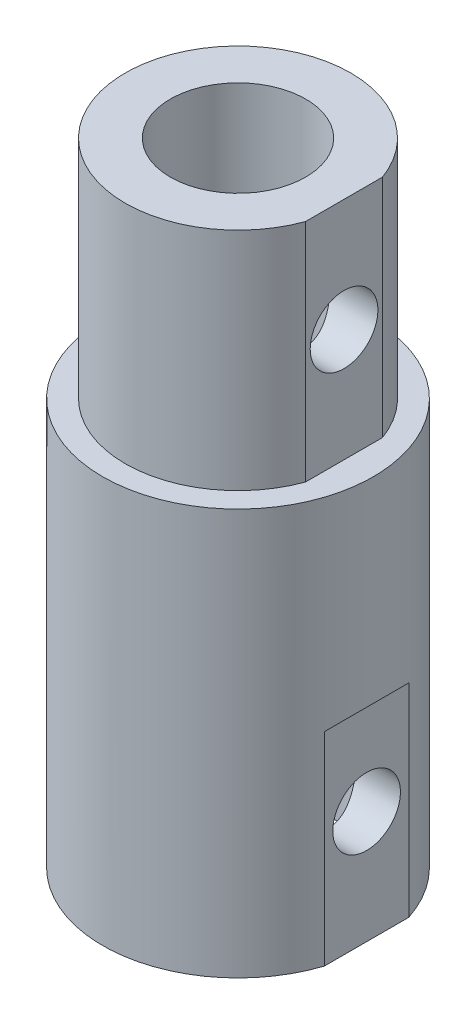
ISO-10303-21;
HEADER;
FILE_DESCRIPTION(('STEP AP214'),'2;1');
FILE_NAME('part.step','',(''),(''),'','','');
FILE_SCHEMA(('AUTOMOTIVE_DESIGN { 1 0 10303 214 1 1 1 1 }'));
ENDSEC;
DATA;
#1=APPLICATION_CONTEXT('core data for automotive mechanical design processes');
#2=APPLICATION_PROTOCOL_DEFINITION('international standard','automotive_design',2000,#1);
#3=PRODUCT_CONTEXT('',#1,'mechanical');
#4=PRODUCT('Part','Part','',(#3));
#5=PRODUCT_RELATED_PRODUCT_CATEGORY('part','',(#4));
#6=PRODUCT_DEFINITION_FORMATION('','',#4);
#7=PRODUCT_DEFINITION_CONTEXT('part definition',#1,'design');
#8=PRODUCT_DEFINITION('design','',#6,#7);
#9=PRODUCT_DEFINITION_SHAPE('','',#8);
#10=(LENGTH_UNIT() NAMED_UNIT(*) SI_UNIT(.MILLI.,.METRE.));
#11=(NAMED_UNIT(*) PLANE_ANGLE_UNIT() SI_UNIT($,.RADIAN.));
#12=(NAMED_UNIT(*) SI_UNIT($,.STERADIAN.) SOLID_ANGLE_UNIT());
#13=UNCERTAINTY_MEASURE_WITH_UNIT(LENGTH_MEASURE(1.E-05),#10,'distance_accuracy_value','');
#14=(GEOMETRIC_REPRESENTATION_CONTEXT(3) GLOBAL_UNCERTAINTY_ASSIGNED_CONTEXT((#13)) GLOBAL_UNIT_ASSIGNED_CONTEXT((#10,
#11,#12)) REPRESENTATION_CONTEXT('',''));
#15=CARTESIAN_POINT('',(0.,0.,0.));
#16=DIRECTION('',(0.,0.,1.));
#17=DIRECTION('',(1.,0.,0.));
#18=AXIS2_PLACEMENT_3D('',#15,#16,#17);
#19=CARTESIAN_POINT('',(0.,28.,0.));
#20=DIRECTION('',(0.,-1.,0.));
#21=DIRECTION('',(0.,0.,-1.));
#22=AXIS2_PLACEMENT_3D('',#19,#20,#21);
#23=CYLINDRICAL_SURFACE('',#22,5.);
#24=CARTESIAN_POINT('',(0.,28.,0.));
#25=DIRECTION('',(0.,1.,0.));
#26=DIRECTION('',(0.,0.,1.));
#27=AXIS2_PLACEMENT_3D('',#24,#25,#26);
#28=CIRCLE('',#27,5.);
#29=CARTESIAN_POINT('',(4.7,28.,-1.7058722109232));
#30=VERTEX_POINT('',#29);
#31=CARTESIAN_POINT('',(4.7,28.,1.7058722109232));
#32=VERTEX_POINT('',#31);
#33=EDGE_CURVE('E82',#30,#32,#28,.T.);
#34=ORIENTED_EDGE('',*,*,#33,.F.);
#35=DIRECTION('',(0.,-1.,0.));
#36=VECTOR('',#35,1.);
#37=CARTESIAN_POINT('',(4.7,28.,-1.7058722109232));
#38=LINE('',#37,#36);
#39=CARTESIAN_POINT('',(4.7,18.,-1.7058722109232));
#40=VERTEX_POINT('',#39);
#41=EDGE_CURVE('E49',#30,#40,#38,.T.);
#42=ORIENTED_EDGE('',*,*,#41,.T.);
#43=CARTESIAN_POINT('',(0.,18.,0.));
#44=DIRECTION('',(0.,1.,0.));
#45=DIRECTION('',(0.,0.,1.));
#46=AXIS2_PLACEMENT_3D('',#43,#44,#45);
#47=CIRCLE('',#46,5.);
#48=CARTESIAN_POINT('',(4.7,18.,1.7058722109232));
#49=VERTEX_POINT('',#48);
#50=EDGE_CURVE('E84',#40,#49,#47,.T.);
#51=ORIENTED_EDGE('',*,*,#50,.T.);
#52=DIRECTION('',(0.,-1.,0.));
#53=VECTOR('',#52,1.);
#54=CARTESIAN_POINT('',(4.7,28.,1.7058722109232));
#55=LINE('',#54,#53);
#56=EDGE_CURVE('E73',#49,#32,#55,.F.);
#57=ORIENTED_EDGE('',*,*,#56,.T.);
#58=EDGE_LOOP('',(#34,#42,#51,#57));
#59=FACE_BOUND('',#58,.T.);
#60=ADVANCED_FACE('F33',(#59),#23,.T.);
#61=CARTESIAN_POINT('',(0.,28.,0.));
#62=DIRECTION('',(0.,-1.,0.));
#63=DIRECTION('',(0.,0.,-1.));
#64=AXIS2_PLACEMENT_3D('',#61,#62,#63);
#65=CYLINDRICAL_SURFACE('',#64,3.);
#66=CARTESIAN_POINT('',(0.,18.,0.));
#67=DIRECTION('',(0.,1.,0.));
#68=DIRECTION('',(0.,0.,1.));
#69=AXIS2_PLACEMENT_3D('',#66,#67,#68);
#70=CIRCLE('',#69,3.);
#71=CARTESIAN_POINT('',(0.,18.,3.));
#72=VERTEX_POINT('',#71);
#73=EDGE_CURVE('E106',#72,#72,#70,.F.);
#74=ORIENTED_EDGE('',*,*,#73,.T.);
#75=EDGE_LOOP('',(#74));
#76=FACE_BOUND('',#75,.T.);
#77=CARTESIAN_POINT('',(0.,28.,0.));
#78=DIRECTION('',(0.,1.,0.));
#79=DIRECTION('',(0.,0.,1.));
#80=AXIS2_PLACEMENT_3D('',#77,#78,#79);
#81=CIRCLE('',#80,3.);
#82=CARTESIAN_POINT('',(0.,28.,3.));
#83=VERTEX_POINT('',#82);
#84=EDGE_CURVE('E93',#83,#83,#81,.T.);
#85=ORIENTED_EDGE('',*,*,#84,.T.);
#86=EDGE_LOOP('',(#85));
#87=FACE_BOUND('',#86,.T.);
#88=CARTESIAN_POINT('',(2.59807621135332,23.,1.5));
#89=CARTESIAN_POINT('',(2.59808302092689,22.9218382877071,1.4999945446118));
#90=CARTESIAN_POINT('',(2.60165701781635,22.8435778827124,1.49384995609983));
#91=CARTESIAN_POINT('',(2.61543549678079,22.6894591029843,1.46958481484708));
#92=CARTESIAN_POINT('',(2.62565391083339,22.6136061274349,1.45143909683127));
#93=CARTESIAN_POINT('',(2.65124019908098,22.4668225034841,1.40414992304972));
#94=CARTESIAN_POINT('',(2.66658065209878,22.3958680212896,1.3750649287406));
#95=CARTESIAN_POINT('',(2.70063997225287,22.2598636970049,1.30690128806456));
#96=CARTESIAN_POINT('',(2.71935902214097,22.1948141746063,1.26782210105366));
#97=CARTESIAN_POINT('',(2.75995303586162,22.0665414071637,1.17699981079632));
#98=CARTESIAN_POINT('',(2.7819609545693,22.0039112964897,1.12447805421566));
#99=CARTESIAN_POINT('',(2.82557974178559,21.8878874173899,1.0098807114217));
#100=CARTESIAN_POINT('',(2.84719040746875,21.8344982561247,0.94780038867344));
#101=CARTESIAN_POINT('',(2.88932215429424,21.7349492732785,0.810734345121819));
#102=CARTESIAN_POINT('',(2.90967159627259,21.6895193482107,0.735160783518863));
#103=CARTESIAN_POINT('',(2.94526134149294,21.6122887201314,0.576235539899257));
#104=CARTESIAN_POINT('',(2.96050486775612,21.5804794157942,0.492888807207233));
#105=CARTESIAN_POINT('',(2.98320691866356,21.5337430080484,0.327067415888965));
#106=CARTESIAN_POINT('',(2.99114220331338,21.5177757104667,0.244952685733226));
#107=CARTESIAN_POINT('',(3.00011375769101,21.4997508219874,0.0788559430467718));
#108=CARTESIAN_POINT('',(3.00115420176885,21.4976848148064,-0.00512490876560811));
#109=CARTESIAN_POINT('',(2.99644472874675,21.5071200109555,-0.164748786635626));
#110=CARTESIAN_POINT('',(2.99127743838241,21.5174570232818,-0.240481798765188));
#111=CARTESIAN_POINT('',(2.97561367889621,21.549321265857,-0.388970657877483));
#112=CARTESIAN_POINT('',(2.96511681099591,21.5708493334643,-0.461726281640888));
#113=CARTESIAN_POINT('',(2.93957374931482,21.6246238491347,-0.603464087354331));
#114=CARTESIAN_POINT('',(2.92446662293799,21.6570144697581,-0.672380135272769));
#115=CARTESIAN_POINT('',(2.89106468980031,21.7313951243022,-0.803965202269994));
#116=CARTESIAN_POINT('',(2.87276874236226,21.7733885949535,-0.866631973257969));
#117=CARTESIAN_POINT('',(2.83266591598844,21.8703430272995,-0.990260491347293));
#118=CARTESIAN_POINT('',(2.81069063997263,21.926154542489,-1.05050111254404));
#119=CARTESIAN_POINT('',(2.76681510880218,22.0468845873953,-1.16115655544667));
#120=CARTESIAN_POINT('',(2.74491492398443,22.1118100584111,-1.21156381736135));
#121=CARTESIAN_POINT('',(2.70216234138727,22.2539722886361,-1.30425800196332));
#122=CARTESIAN_POINT('',(2.68146479986061,22.3317290345813,-1.34582597246708));
#123=CARTESIAN_POINT('',(2.64563175417864,22.4944065070385,-1.41497866950185));
#124=CARTESIAN_POINT('',(2.63049045069101,22.5793196495263,-1.44257798731634));
#125=CARTESIAN_POINT('',(2.60916953725552,22.7468217669242,-1.48077031653756));
#126=CARTESIAN_POINT('',(2.60237483772745,22.8290616785653,-1.49253768317996));
#127=CARTESIAN_POINT('',(2.59676879042414,22.9946020122748,-1.50227541991714));
#128=CARTESIAN_POINT('',(2.59795180333967,23.0779016436797,-1.50025553597254));
#129=CARTESIAN_POINT('',(2.60751504810877,23.2334808778681,-1.48355406501595));
#130=CARTESIAN_POINT('',(2.61509381259981,23.3059691766619,-1.4702817250687));
#131=CARTESIAN_POINT('',(2.63541032327012,23.4475516794064,-1.43354442694866));
#132=CARTESIAN_POINT('',(2.64814974007551,23.5166447761199,-1.41007616793542));
#133=CARTESIAN_POINT('',(2.67804333119485,23.653116996354,-1.35247138290733));
#134=CARTESIAN_POINT('',(2.69537464864595,23.7202685252803,-1.31789109553909));
#135=CARTESIAN_POINT('',(2.73234179245875,23.8482039073085,-1.23943059602371));
#136=CARTESIAN_POINT('',(2.75197880032721,23.9089844652699,-1.19554560649833));
#137=CARTESIAN_POINT('',(2.79431997684504,24.0304681512853,-1.09325575079828));
#138=CARTESIAN_POINT('',(2.81709874731434,24.0901957260765,-1.03371790847245));
#139=CARTESIAN_POINT('',(2.86101352466839,24.1991183569904,-0.905106743097434));
#140=CARTESIAN_POINT('',(2.88214897511564,24.2483098553458,-0.836030211983022));
#141=CARTESIAN_POINT('',(2.92112042536435,24.3358605889252,-0.687803043838138));
#142=CARTESIAN_POINT('',(2.93885462508044,24.3738996773164,-0.608434646361172));
#143=CARTESIAN_POINT('',(2.96825032438951,24.4357068557861,-0.443283546961625));
#144=CARTESIAN_POINT('',(2.9799171551456,24.4594874770495,-0.357506552088266));
#145=CARTESIAN_POINT('',(2.99501262272824,24.490052846262,-0.190469523495627));
#146=CARTESIAN_POINT('',(2.99909891862287,24.4981968138142,-0.109517165775687));
#147=CARTESIAN_POINT('',(3.00063195562697,24.5012648981816,0.0526889789268048));
#148=CARTESIAN_POINT('',(2.99808102100335,24.4961936427854,0.13394265044263));
#149=CARTESIAN_POINT('',(2.98700953256884,24.4738753898066,0.28880698847572));
#150=CARTESIAN_POINT('',(2.97889342001985,24.4574527261135,0.362568476716895));
#151=CARTESIAN_POINT('',(2.95788140495135,24.4140095010455,0.506168928275425));
#152=CARTESIAN_POINT('',(2.94498481699194,24.3869874198598,0.576007327433262));
#153=CARTESIAN_POINT('',(2.9148889612218,24.321909421751,0.713135109367327));
#154=CARTESIAN_POINT('',(2.89752925798199,24.2834310151882,0.780187714050069));
#155=CARTESIAN_POINT('',(2.86032199712739,24.1970631037114,0.907161962721037));
#156=CARTESIAN_POINT('',(2.84047329837541,24.1491692763265,0.967080311122361));
#157=CARTESIAN_POINT('',(2.79792915339941,24.0398042914659,1.08437100623534));
#158=CARTESIAN_POINT('',(2.77514698517547,23.9774562687842,1.14089652680891));
#159=CARTESIAN_POINT('',(2.73094614244278,23.8438239183053,1.24299493109201));
#160=CARTESIAN_POINT('',(2.70952868642798,23.7725317686985,1.28855812501509));
#161=CARTESIAN_POINT('',(2.66999407957374,23.6200450301286,1.36864661967848));
#162=CARTESIAN_POINT('',(2.65200261384405,23.5386087033069,1.40277759894141));
#163=CARTESIAN_POINT('',(2.62299234492527,23.3700013934903,1.45631806425962));
#164=CARTESIAN_POINT('',(2.61195024221553,23.282850666631,1.47577678676302));
#165=CARTESIAN_POINT('',(2.60293908902686,23.162291966522,1.49155051179662));
#166=CARTESIAN_POINT('',(2.60112193507728,23.1299481584032,1.49471415744578));
#167=CARTESIAN_POINT('',(2.59868903831625,23.0650752789766,1.49894010763495));
#168=CARTESIAN_POINT('',(2.59807337587664,23.0325461954212,1.50000227159981));
#169=CARTESIAN_POINT('',(2.59807621135332,23.,1.5));
#170=B_SPLINE_CURVE_WITH_KNOTS('',3,(#88,#89,#90,#91,#92,#93,#94,#95,#96,#97,#98,#99,#100,#101,
#102,#103,#104,#105,#106,#107,#108,#109,#110,#111,#112,#113,#114,#115,#116,#117,#118,#119,#120,
#121,#122,#123,#124,#125,#126,#127,#128,#129,#130,#131,#132,#133,#134,#135,#136,#137,#138,#139,
#140,#141,#142,#143,#144,#145,#146,#147,#148,#149,#150,#151,#152,#153,#154,#155,#156,#157,#158,
#159,#160,#161,#162,#163,#164,#165,#166,#167,#168,#169),.UNSPECIFIED.,.T.,.F.,(4,2,2,2,2,2,2,2,
2,2,2,2,2,2,2,2,2,2,2,2,2,2,2,2,2,2,2,2,2,2,2,2,2,2,2,2,2,2,2,2,4),(0.,0.234348183892075,
0.469189339237207,0.702792893878331,0.936409088167727,1.18929346874735,1.44230356626557,
1.71236838358145,1.98226240445837,2.23295227451903,2.4834903552906,2.71224146226808,
2.94100968776183,3.1729430209672,3.40495949025408,3.65890787185336,3.91305072368878,
4.18333262594173,4.45333161317557,4.70193436281318,4.9503613978256,5.17161275136038,
5.39293578654095,5.62450944609132,5.85620229330071,6.1171011537092,6.37808797467303,
6.64596272119449,6.91360169713158,7.15668405584231,7.39968130190958,7.62666637307239,
7.8536840026802,8.09041126079208,8.32724745151079,8.58765362775102,8.84828914267732,
9.11716123557909,9.38512699504141,9.48270202777965,9.58028358741812),.UNSPECIFIED.);
#171=CARTESIAN_POINT('',(2.59807621135332,23.,1.5));
#172=VERTEX_POINT('',#171);
#173=EDGE_CURVE('E116',#172,#172,#170,.T.);
#174=ORIENTED_EDGE('',*,*,#173,.T.);
#175=EDGE_LOOP('',(#174));
#176=FACE_BOUND('',#175,.T.);
#177=ADVANCED_FACE('F134',(#76,#87,#176),#65,.F.);
#178=CARTESIAN_POINT('',(0.,10.,0.));
#179=DIRECTION('',(0.,-1.,0.));
#180=DIRECTION('',(0.,0.,-1.));
#181=AXIS2_PLACEMENT_3D('',#178,#179,#180);
#182=CYLINDRICAL_SURFACE('',#181,6.);
#183=DIRECTION('',(0.,-1.,0.));
#184=VECTOR('',#183,1.);
#185=CARTESIAN_POINT('',(5.7,10.,1.87349939951952));
#186=LINE('',#185,#184);
#187=CARTESIAN_POINT('',(5.7,0.,1.87349939951952));
#188=VERTEX_POINT('',#187);
#189=CARTESIAN_POINT('',(5.7,8.99999999999999,1.87349939951952));
#190=VERTEX_POINT('',#189);
#191=EDGE_CURVE('E170',#188,#190,#186,.F.);
#192=ORIENTED_EDGE('',*,*,#191,.T.);
#193=CARTESIAN_POINT('',(0.,3.30000000000005,0.));
#194=DIRECTION('',(-0.707106781186544,0.707106781186551,0.));
#195=DIRECTION('',(-0.707106781186551,-0.707106781186544,0.));
#196=AXIS2_PLACEMENT_3D('',#193,#194,#195);
#197=ELLIPSE('',#196,8.48528137423853,6.);
#198=CARTESIAN_POINT('',(5.7,8.99999999999999,-1.87349939951952));
#199=VERTEX_POINT('',#198);
#200=EDGE_CURVE('E11',#190,#199,#197,.T.);
#201=ORIENTED_EDGE('',*,*,#200,.T.);
#202=DIRECTION('',(0.,-1.,0.));
#203=VECTOR('',#202,1.);
#204=CARTESIAN_POINT('',(5.7,10.,-1.87349939951952));
#205=LINE('',#204,#203);
#206=CARTESIAN_POINT('',(5.7,0.,-1.87349939951952));
#207=VERTEX_POINT('',#206);
#208=EDGE_CURVE('E181',#199,#207,#205,.T.);
#209=ORIENTED_EDGE('',*,*,#208,.T.);
#210=CARTESIAN_POINT('',(0.,0.,0.));
#211=DIRECTION('',(0.,1.,0.));
#212=DIRECTION('',(0.,0.,1.));
#213=AXIS2_PLACEMENT_3D('',#210,#211,#212);
#214=CIRCLE('',#213,6.);
#215=EDGE_CURVE('E103',#207,#188,#214,.T.);
#216=ORIENTED_EDGE('',*,*,#215,.T.);
#217=EDGE_LOOP('',(#192,#201,#209,#216));
#218=FACE_BOUND('',#217,.T.);
#219=CARTESIAN_POINT('',(0.,18.,0.));
#220=DIRECTION('',(0.,1.,0.));
#221=DIRECTION('',(0.,0.,1.));
#222=AXIS2_PLACEMENT_3D('',#219,#220,#221);
#223=CIRCLE('',#222,6.);
#224=CARTESIAN_POINT('',(0.,18.,6.));
#225=VERTEX_POINT('',#224);
#226=EDGE_CURVE('E88',#225,#225,#223,.T.);
#227=ORIENTED_EDGE('',*,*,#226,.F.);
#228=EDGE_LOOP('',(#227));
#229=FACE_BOUND('',#228,.T.);
#230=ADVANCED_FACE('F138',(#218,#229),#182,.T.);
#231=CARTESIAN_POINT('',(0.,10.,0.));
#232=DIRECTION('',(0.,-1.,0.));
#233=DIRECTION('',(0.,0.,-1.));
#234=AXIS2_PLACEMENT_3D('',#231,#232,#233);
#235=CYLINDRICAL_SURFACE('',#234,4.);
#236=CARTESIAN_POINT('',(0.,0.,0.));
#237=DIRECTION('',(0.,1.,0.));
#238=DIRECTION('',(0.,0.,1.));
#239=AXIS2_PLACEMENT_3D('',#236,#237,#238);
#240=CIRCLE('',#239,4.);
#241=CARTESIAN_POINT('',(0.,0.,4.));
#242=VERTEX_POINT('',#241);
#243=EDGE_CURVE('E100',#242,#242,#240,.T.);
#244=ORIENTED_EDGE('',*,*,#243,.F.);
#245=EDGE_LOOP('',(#244));
#246=FACE_BOUND('',#245,.T.);
#247=CARTESIAN_POINT('',(0.,10.,0.));
#248=DIRECTION('',(0.,1.,0.));
#249=DIRECTION('',(0.,0.,1.));
#250=AXIS2_PLACEMENT_3D('',#247,#248,#249);
#251=CIRCLE('',#250,4.);
#252=CARTESIAN_POINT('',(0.,10.,4.));
#253=VERTEX_POINT('',#252);
#254=EDGE_CURVE('E91',#253,#253,#251,.T.);
#255=ORIENTED_EDGE('',*,*,#254,.T.);
#256=EDGE_LOOP('',(#255));
#257=FACE_BOUND('',#256,.T.);
#258=CARTESIAN_POINT('',(3.70809924354783,5.,1.5));
#259=CARTESIAN_POINT('',(3.70809640633806,4.91899251627921,1.50000304106109));
#260=CARTESIAN_POINT('',(3.71078260240986,4.83800507749636,1.49341597549487));
#261=CARTESIAN_POINT('',(3.72116159304967,4.6784719170868,1.46736187895468));
#262=CARTESIAN_POINT('',(3.72885423767112,4.59992612240499,1.44789523373263));
#263=CARTESIAN_POINT('',(3.748254802809,4.44762462838647,1.39689657610574));
#264=CARTESIAN_POINT('',(3.7599530956926,4.37385794334892,1.36539347266348));
#265=CARTESIAN_POINT('',(3.78603134206598,4.23262810318116,1.29131856742698));
#266=CARTESIAN_POINT('',(3.80041210067323,4.16516684971748,1.24874344095039));
#267=CARTESIAN_POINT('',(3.83103574665713,4.03510968837718,1.15146661374162));
#268=CARTESIAN_POINT('',(3.84733341923603,3.97287147037061,1.09630381213306));
#269=CARTESIAN_POINT('',(3.87949750628547,3.85827718532851,0.976395839778925));
#270=CARTESIAN_POINT('',(3.89536382814785,3.80592322625814,0.911648630256679));
#271=CARTESIAN_POINT('',(3.92552873936553,3.71086048770439,0.771694655177599));
#272=CARTESIAN_POINT('',(3.93975561223505,3.66854052528414,0.696206947538027));
#273=CARTESIAN_POINT('',(3.96438007973848,3.59734882747509,0.538555771965246));
#274=CARTESIAN_POINT('',(3.97477900217006,3.56847242800802,0.456394630933535));
#275=CARTESIAN_POINT('',(3.9901869710344,3.52624210422538,0.291489341676831));
#276=CARTESIAN_POINT('',(3.99540915214774,3.51227237255954,0.208923197281595));
#277=CARTESIAN_POINT('',(4.0006401410794,3.49827879905501,0.0424643637947845));
#278=CARTESIAN_POINT('',(4.00065064414902,3.49825042238129,-0.0414278850628344));
#279=CARTESIAN_POINT('',(3.99559265903894,3.51178176146517,-0.203743543064477));
#280=CARTESIAN_POINT('',(3.99077541996683,3.52466929794881,-0.282232178266901));
#281=CARTESIAN_POINT('',(3.97693274932263,3.56253591522555,-0.435839217984392));
#282=CARTESIAN_POINT('',(3.96790701975577,3.58751585226204,-0.5109573834303));
#283=CARTESIAN_POINT('',(3.94637769167531,3.64917045167585,-0.656989017303105));
#284=CARTESIAN_POINT('',(3.93382539470077,3.68601000526841,-0.72782539228731));
#285=CARTESIAN_POINT('',(3.90651310225279,3.77019209692939,-0.86248660795756));
#286=CARTESIAN_POINT('',(3.8917523951284,3.8175380230176,-0.926309176932324));
#287=CARTESIAN_POINT('',(3.86052529655816,3.92462728628319,-1.04909048680094));
#288=CARTESIAN_POINT('',(3.84400963763883,3.98493391565043,-1.10754614526348));
#289=CARTESIAN_POINT('',(3.81182460645722,4.11459299332156,-1.21370395569342));
#290=CARTESIAN_POINT('',(3.79615544748847,4.18394770658664,-1.261403406929));
#291=CARTESIAN_POINT('',(3.76712703500335,4.33171946746282,-1.34565611808152));
#292=CARTESIAN_POINT('',(3.75382677150277,4.41030349368607,-1.38193847851831));
#293=CARTESIAN_POINT('',(3.73172438629002,4.57309622516757,-1.44056464441501));
#294=CARTESIAN_POINT('',(3.72291976205783,4.65730177159369,-1.46291620605595));
#295=CARTESIAN_POINT('',(3.71139597222848,4.82397596231596,-1.49190191709668));
#296=CARTESIAN_POINT('',(3.70836785241537,4.90628410553614,-1.49933521158966));
#297=CARTESIAN_POINT('',(3.70786539525016,5.07100935674174,-1.50057885636272));
#298=CARTESIAN_POINT('',(3.71038967003987,5.15342643235247,-1.49439261093762));
#299=CARTESIAN_POINT('',(3.72039381629735,5.31192992228768,-1.46929733520157));
#300=CARTESIAN_POINT('',(3.72763276216449,5.38813113576466,-1.45100618334225));
#301=CARTESIAN_POINT('',(3.74596487046362,5.53634794472019,-1.40299774640637));
#302=CARTESIAN_POINT('',(3.75705882250173,5.60836267916814,-1.37327812034623));
#303=CARTESIAN_POINT('',(3.7823624311608,5.74916443807621,-1.30200292275278));
#304=CARTESIAN_POINT('',(3.79667328892065,5.81772929213734,-1.26004545177047));
#305=CARTESIAN_POINT('',(3.82662814294291,5.94712898172604,-1.16591317862479));
#306=CARTESIAN_POINT('',(3.84227262594077,6.00796097462463,-1.11373463696434));
#307=CARTESIAN_POINT('',(3.87433046553184,6.1241683731951,-0.996727340900937));
#308=CARTESIAN_POINT('',(3.89072969357028,6.17895340876875,-0.93130634149106));
#309=CARTESIAN_POINT('',(3.92149874963302,6.27683836758944,-0.791797471753149));
#310=CARTESIAN_POINT('',(3.93586857107664,6.31993825294584,-0.717709573322671));
#311=CARTESIAN_POINT('',(3.96094985704552,6.39294605619961,-0.563016329468475));
#312=CARTESIAN_POINT('',(3.9716738133801,6.4228991237926,-0.482434433064625));
#313=CARTESIAN_POINT('',(3.98829436712571,6.46865641384992,-0.316881887523253));
#314=CARTESIAN_POINT('',(3.99419323299413,6.4844672854224,-0.231913320723591));
#315=CARTESIAN_POINT('',(4.00028407317073,6.50077440275483,-0.0653355852738142));
#316=CARTESIAN_POINT('',(4.00078860953764,6.50210948305899,0.0161807680608465));
#317=CARTESIAN_POINT('',(3.99684889809223,6.49158484055461,0.178226786412425));
#318=CARTESIAN_POINT('',(3.9924052471313,6.47972670911414,0.258756569245259));
#319=CARTESIAN_POINT('',(3.97921089603771,6.44374114850638,0.414548248377128));
#320=CARTESIAN_POINT('',(3.97056791378017,6.41992009412164,0.489890731068836));
#321=CARTESIAN_POINT('',(3.9498778362099,6.36098998661564,0.635515473006392));
#322=CARTESIAN_POINT('',(3.93783009655664,6.32587879669525,0.705796771275544));
#323=CARTESIAN_POINT('',(3.91090618300074,6.24368605649519,0.842540176994414));
#324=CARTESIAN_POINT('',(3.89593240108828,6.19616335948585,0.908717548846851));
#325=CARTESIAN_POINT('',(3.86499507694844,6.09119216981239,1.03241734752336));
#326=CARTESIAN_POINT('',(3.84903118274027,6.03374013419212,1.0899366712559));
#327=CARTESIAN_POINT('',(3.81688129739175,5.90693586835494,1.19781214236196));
#328=CARTESIAN_POINT('',(3.8007280534916,5.83711559784569,1.24762999816025));
#329=CARTESIAN_POINT('',(3.77098325003638,5.68958413042667,1.33484709556843));
#330=CARTESIAN_POINT('',(3.75739195631216,5.61187211594652,1.37224504878157));
#331=CARTESIAN_POINT('',(3.73402269853266,5.44704431902459,1.4346588697426));
#332=CARTESIAN_POINT('',(3.7244380329086,5.35966563348822,1.45906002899523));
#333=CARTESIAN_POINT('',(3.71147994336315,5.18151472804421,1.49172356722079));
#334=CARTESIAN_POINT('',(3.70810242179736,5.09074478729001,1.49999659339571));
#335=CARTESIAN_POINT('',(3.70809924354783,5.,1.5));
#336=B_SPLINE_CURVE_WITH_KNOTS('',3,(#258,#259,#260,#261,#262,#263,#264,#265,#266,#267,#268,
#269,#270,#271,#272,#273,#274,#275,#276,#277,#278,#279,#280,#281,#282,#283,#284,#285,#286,#287,
#288,#289,#290,#291,#292,#293,#294,#295,#296,#297,#298,#299,#300,#301,#302,#303,#304,#305,#306,
#307,#308,#309,#310,#311,#312,#313,#314,#315,#316,#317,#318,#319,#320,#321,#322,#323,#324,#325,
#326,#327,#328,#329,#330,#331,#332,#333,#334,#335),.UNSPECIFIED.,.T.,.F.,(4,2,2,2,2,2,2,2,2,2,2,
2,2,2,2,2,2,2,2,2,2,2,2,2,2,2,2,2,2,2,2,2,2,2,2,2,2,2,4),(0.,0.24268454141617,0.485361814598855,
0.727459856757031,0.969630679682934,1.22274652401128,1.47591628822983,1.73770072136421,
1.9993942638133,2.24980018489679,2.50012465404857,2.73806472803194,2.97602165263335,
3.21744131210668,3.45893893628976,3.71456675065875,3.97025867827335,4.23162592252967,
4.49284751635474,4.73965657740485,4.98640395388885,5.22143845928199,5.45652113429526,
5.70041561005822,5.94439948466355,6.20385016993624,6.46330169650178,6.72185508890169,
6.98028685560127,7.22365720549936,7.4669982031948,7.70440274003891,7.94185223512831,
8.18928323676987,8.43680270894965,8.69738599542079,8.95799630544243,9.23003178870926,
9.50188762323053),.UNSPECIFIED.);
#337=CARTESIAN_POINT('',(3.70809924354783,5.,1.5));
#338=VERTEX_POINT('',#337);
#339=EDGE_CURVE('E109',#338,#338,#336,.T.);
#340=ORIENTED_EDGE('',*,*,#339,.T.);
#341=EDGE_LOOP('',(#340));
#342=FACE_BOUND('',#341,.T.);
#343=ADVANCED_FACE('F122',(#246,#257,#342),#235,.F.);
#344=CARTESIAN_POINT('',(0.,0.,0.));
#345=DIRECTION('',(0.,1.,0.));
#346=DIRECTION('',(0.,0.,1.));
#347=AXIS2_PLACEMENT_3D('',#344,#345,#346);
#348=PLANE('',#347);
#349=ORIENTED_EDGE('',*,*,#215,.F.);
#350=DIRECTION('',(0.,0.,-1.));
#351=VECTOR('',#350,1.);
#352=CARTESIAN_POINT('',(5.7,0.,-3.5893429851549));
#353=LINE('',#352,#351);
#354=EDGE_CURVE('E177',#188,#207,#353,.T.);
#355=ORIENTED_EDGE('',*,*,#354,.F.);
#356=EDGE_LOOP('',(#349,#355));
#357=FACE_BOUND('',#356,.T.);
#358=ORIENTED_EDGE('',*,*,#243,.T.);
#359=EDGE_LOOP('',(#358));
#360=FACE_BOUND('',#359,.T.);
#361=ADVANCED_FACE('F149',(#357,#360),#348,.F.);
#362=CARTESIAN_POINT('',(0.,10.,0.));
#363=DIRECTION('',(0.,1.,0.));
#364=DIRECTION('',(0.,0.,1.));
#365=AXIS2_PLACEMENT_3D('',#362,#363,#364);
#366=PLANE('',#365);
#367=ORIENTED_EDGE('',*,*,#254,.F.);
#368=EDGE_LOOP('',(#367));
#369=FACE_BOUND('',#368,.T.);
#370=ADVANCED_FACE('F146',(#369),#366,.F.);
#371=CARTESIAN_POINT('',(0.,18.,0.));
#372=DIRECTION('',(0.,1.,0.));
#373=DIRECTION('',(0.,0.,1.));
#374=AXIS2_PLACEMENT_3D('',#371,#372,#373);
#375=PLANE('',#374);
#376=ORIENTED_EDGE('',*,*,#226,.T.);
#377=EDGE_LOOP('',(#376));
#378=FACE_BOUND('',#377,.T.);
#379=ORIENTED_EDGE('',*,*,#50,.F.);
#380=DIRECTION('',(0.,0.,1.));
#381=VECTOR('',#380,1.);
#382=CARTESIAN_POINT('',(4.7,18.,2.30321609332035));
#383=LINE('',#382,#381);
#384=EDGE_CURVE('E78',#40,#49,#383,.T.);
#385=ORIENTED_EDGE('',*,*,#384,.T.);
#386=EDGE_LOOP('',(#379,#385));
#387=FACE_BOUND('',#386,.T.);
#388=ADVANCED_FACE('F142',(#378,#387),#375,.T.);
#389=CARTESIAN_POINT('',(0.,28.,0.));
#390=DIRECTION('',(0.,1.,0.));
#391=DIRECTION('',(0.,0.,1.));
#392=AXIS2_PLACEMENT_3D('',#389,#390,#391);
#393=PLANE('',#392);
#394=DIRECTION('',(0.,0.,1.));
#395=VECTOR('',#394,1.);
#396=CARTESIAN_POINT('',(4.7,28.,2.30321609332035));
#397=LINE('',#396,#395);
#398=EDGE_CURVE('E70',#30,#32,#397,.T.);
#399=ORIENTED_EDGE('',*,*,#398,.F.);
#400=ORIENTED_EDGE('',*,*,#33,.T.);
#401=EDGE_LOOP('',(#399,#400));
#402=FACE_BOUND('',#401,.T.);
#403=ORIENTED_EDGE('',*,*,#84,.F.);
#404=EDGE_LOOP('',(#403));
#405=FACE_BOUND('',#404,.T.);
#406=ADVANCED_FACE('F86',(#402,#405),#393,.T.);
#407=ORIENTED_EDGE('',*,*,#73,.F.);
#408=EDGE_LOOP('',(#407));
#409=FACE_BOUND('',#408,.T.);
#410=ADVANCED_FACE('F130',(#409),#375,.T.);
#411=CARTESIAN_POINT('',(10.,5.,0.));
#412=DIRECTION('',(-1.,0.,0.));
#413=DIRECTION('',(0.,0.,1.));
#414=AXIS2_PLACEMENT_3D('',#411,#412,#413);
#415=CYLINDRICAL_SURFACE('',#414,1.5);
#416=CARTESIAN_POINT('',(5.7,5.,0.));
#417=DIRECTION('',(-1.,0.,0.));
#418=DIRECTION('',(0.,0.,1.));
#419=AXIS2_PLACEMENT_3D('',#416,#417,#418);
#420=CIRCLE('',#419,1.5);
#421=CARTESIAN_POINT('',(5.7,5.,1.5));
#422=VERTEX_POINT('',#421);
#423=EDGE_CURVE('E180',#422,#422,#420,.T.);
#424=ORIENTED_EDGE('',*,*,#423,.F.);
#425=EDGE_LOOP('',(#424));
#426=FACE_BOUND('',#425,.T.);
#427=ORIENTED_EDGE('',*,*,#339,.F.);
#428=EDGE_LOOP('',(#427));
#429=FACE_BOUND('',#428,.T.);
#430=ADVANCED_FACE('F126',(#426,#429),#415,.F.);
#431=CARTESIAN_POINT('',(10.,23.,0.));
#432=DIRECTION('',(-1.,0.,0.));
#433=DIRECTION('',(0.,0.,1.));
#434=AXIS2_PLACEMENT_3D('',#431,#432,#433);
#435=CYLINDRICAL_SURFACE('',#434,1.5);
#436=CARTESIAN_POINT('',(4.7,23.,0.));
#437=DIRECTION('',(-1.,0.,0.));
#438=DIRECTION('',(0.,0.,1.));
#439=AXIS2_PLACEMENT_3D('',#436,#437,#438);
#440=CIRCLE('',#439,1.5);
#441=CARTESIAN_POINT('',(4.7,23.,1.5));
#442=VERTEX_POINT('',#441);
#443=EDGE_CURVE('E37',#442,#442,#440,.T.);
#444=ORIENTED_EDGE('',*,*,#443,.F.);
#445=EDGE_LOOP('',(#444));
#446=FACE_BOUND('',#445,.T.);
#447=ORIENTED_EDGE('',*,*,#173,.F.);
#448=EDGE_LOOP('',(#447));
#449=FACE_BOUND('',#448,.T.);
#450=ADVANCED_FACE('F129',(#446,#449),#435,.F.);
#451=CARTESIAN_POINT('',(5.7,10.,-3.5893429851549));
#452=DIRECTION('',(-1.,0.,0.));
#453=DIRECTION('',(0.,0.,1.));
#454=AXIS2_PLACEMENT_3D('',#451,#452,#453);
#455=PLANE('',#454);
#456=ORIENTED_EDGE('',*,*,#423,.T.);
#457=EDGE_LOOP('',(#456));
#458=FACE_BOUND('',#457,.T.);
#459=ORIENTED_EDGE('',*,*,#208,.F.);
#460=DIRECTION('',(0.,0.,1.));
#461=VECTOR('',#460,1.);
#462=CARTESIAN_POINT('',(5.7,8.99999999999999,-3.5893429851549));
#463=LINE('',#462,#461);
#464=EDGE_CURVE('E42',#199,#190,#463,.T.);
#465=ORIENTED_EDGE('',*,*,#464,.T.);
#466=ORIENTED_EDGE('',*,*,#191,.F.);
#467=ORIENTED_EDGE('',*,*,#354,.T.);
#468=EDGE_LOOP('',(#459,#465,#466,#467));
#469=FACE_BOUND('',#468,.T.);
#470=ADVANCED_FACE('F187',(#458,#469),#455,.F.);
#471=CARTESIAN_POINT('',(6.70000000000002,10.,0.));
#472=DIRECTION('',(-0.707106781186544,0.707106781186551,0.));
#473=DIRECTION('',(0.,0.,-1.));
#474=AXIS2_PLACEMENT_3D('',#471,#472,#473);
#475=PLANE('',#474);
#476=ORIENTED_EDGE('',*,*,#200,.F.);
#477=ORIENTED_EDGE('',*,*,#464,.F.);
#478=EDGE_LOOP('',(#476,#477));
#479=FACE_BOUND('',#478,.T.);
#480=ADVANCED_FACE('F35',(#479),#475,.F.);
#481=CARTESIAN_POINT('',(4.7,18.,2.30321609332035));
#482=DIRECTION('',(-1.,0.,0.));
#483=DIRECTION('',(0.,0.,1.));
#484=AXIS2_PLACEMENT_3D('',#481,#482,#483);
#485=PLANE('',#484);
#486=ORIENTED_EDGE('',*,*,#443,.T.);
#487=EDGE_LOOP('',(#486));
#488=FACE_BOUND('',#487,.T.);
#489=ORIENTED_EDGE('',*,*,#398,.T.);
#490=ORIENTED_EDGE('',*,*,#56,.F.);
#491=ORIENTED_EDGE('',*,*,#384,.F.);
#492=ORIENTED_EDGE('',*,*,#41,.F.);
#493=EDGE_LOOP('',(#489,#490,#491,#492));
#494=FACE_BOUND('',#493,.T.);
#495=ADVANCED_FACE('F72',(#488,#494),#485,.F.);
#496=CLOSED_SHELL('',(#60,#177,#230,#343,#361,#370,#388,#406,#410,#430,#450,#470,#480,#495));
#497=MANIFOLD_SOLID_BREP('B2',#496);
#498=ADVANCED_BREP_SHAPE_REPRESENTATION('',(#18,#497),#14);
#499=SHAPE_DEFINITION_REPRESENTATION(#9,#498);
ENDSEC;
END-ISO-10303-21;
